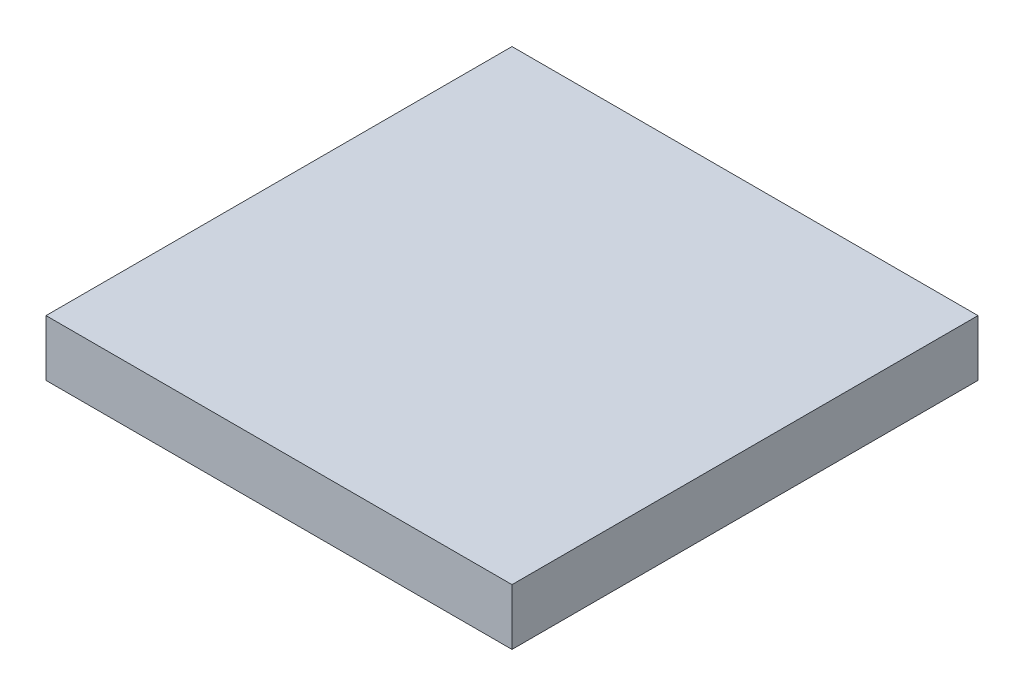
ISO-10303-21;
HEADER;
FILE_DESCRIPTION(('STEP AP214'),'2;1');
FILE_NAME('part.step','',(''),(''),'','','');
FILE_SCHEMA(('AUTOMOTIVE_DESIGN { 1 0 10303 214 1 1 1 1 }'));
ENDSEC;
DATA;
#1=APPLICATION_CONTEXT('core data for automotive mechanical design processes');
#2=APPLICATION_PROTOCOL_DEFINITION('international standard','automotive_design',2000,#1);
#3=PRODUCT_CONTEXT('',#1,'mechanical');
#4=PRODUCT('Part','Part','',(#3));
#5=PRODUCT_RELATED_PRODUCT_CATEGORY('part','',(#4));
#6=PRODUCT_DEFINITION_FORMATION('','',#4);
#7=PRODUCT_DEFINITION_CONTEXT('part definition',#1,'design');
#8=PRODUCT_DEFINITION('design','',#6,#7);
#9=PRODUCT_DEFINITION_SHAPE('','',#8);
#10=(LENGTH_UNIT() NAMED_UNIT(*) SI_UNIT(.MILLI.,.METRE.));
#11=(NAMED_UNIT(*) PLANE_ANGLE_UNIT() SI_UNIT($,.RADIAN.));
#12=(NAMED_UNIT(*) SI_UNIT($,.STERADIAN.) SOLID_ANGLE_UNIT());
#13=UNCERTAINTY_MEASURE_WITH_UNIT(LENGTH_MEASURE(1.E-05),#10,'distance_accuracy_value','');
#14=(GEOMETRIC_REPRESENTATION_CONTEXT(3) GLOBAL_UNCERTAINTY_ASSIGNED_CONTEXT((#13)) GLOBAL_UNIT_ASSIGNED_CONTEXT((#10,
#11,#12)) REPRESENTATION_CONTEXT('',''));
#15=CARTESIAN_POINT('',(0.,0.,0.));
#16=DIRECTION('',(0.,0.,1.));
#17=DIRECTION('',(1.,0.,0.));
#18=AXIS2_PLACEMENT_3D('',#15,#16,#17);
#19=CARTESIAN_POINT('',(4.15,1.,4.15));
#20=DIRECTION('',(-1.,0.,0.));
#21=DIRECTION('',(0.,0.,1.));
#22=AXIS2_PLACEMENT_3D('',#19,#20,#21);
#23=PLANE('',#22);
#24=DIRECTION('',(0.,0.,-1.));
#25=VECTOR('',#24,1.);
#26=CARTESIAN_POINT('',(4.15,0.,4.15));
#27=LINE('',#26,#25);
#28=CARTESIAN_POINT('',(4.15,0.,4.15));
#29=VERTEX_POINT('',#28);
#30=CARTESIAN_POINT('',(4.15,0.,-4.15));
#31=VERTEX_POINT('',#30);
#32=EDGE_CURVE('E104',#29,#31,#27,.T.);
#33=ORIENTED_EDGE('',*,*,#32,.T.);
#34=DIRECTION('',(0.,-1.,0.));
#35=VECTOR('',#34,1.);
#36=CARTESIAN_POINT('',(4.15,1.,-4.15));
#37=LINE('',#36,#35);
#38=CARTESIAN_POINT('',(4.15,1.,-4.15));
#39=VERTEX_POINT('',#38);
#40=EDGE_CURVE('E11',#39,#31,#37,.T.);
#41=ORIENTED_EDGE('',*,*,#40,.F.);
#42=DIRECTION('',(0.,0.,-1.));
#43=VECTOR('',#42,1.);
#44=CARTESIAN_POINT('',(4.15,1.,4.15));
#45=LINE('',#44,#43);
#46=CARTESIAN_POINT('',(4.15,1.,4.15));
#47=VERTEX_POINT('',#46);
#48=EDGE_CURVE('E92',#47,#39,#45,.T.);
#49=ORIENTED_EDGE('',*,*,#48,.F.);
#50=DIRECTION('',(0.,-1.,0.));
#51=VECTOR('',#50,1.);
#52=CARTESIAN_POINT('',(4.15,1.,4.15));
#53=LINE('',#52,#51);
#54=EDGE_CURVE('E100',#47,#29,#53,.T.);
#55=ORIENTED_EDGE('',*,*,#54,.T.);
#56=EDGE_LOOP('',(#33,#41,#49,#55));
#57=FACE_BOUND('',#56,.T.);
#58=ADVANCED_FACE('F41',(#57),#23,.F.);
#59=CARTESIAN_POINT('',(-4.15,1.,-4.15));
#60=DIRECTION('',(0.,0.,1.));
#61=DIRECTION('',(1.,0.,0.));
#62=AXIS2_PLACEMENT_3D('',#59,#60,#61);
#63=PLANE('',#62);
#64=DIRECTION('',(-1.,0.,0.));
#65=VECTOR('',#64,1.);
#66=CARTESIAN_POINT('',(-4.15,0.,-4.15));
#67=LINE('',#66,#65);
#68=CARTESIAN_POINT('',(-4.15,0.,-4.15));
#69=VERTEX_POINT('',#68);
#70=EDGE_CURVE('E96',#31,#69,#67,.T.);
#71=ORIENTED_EDGE('',*,*,#70,.T.);
#72=DIRECTION('',(0.,-1.,0.));
#73=VECTOR('',#72,1.);
#74=CARTESIAN_POINT('',(-4.15,1.,-4.15));
#75=LINE('',#74,#73);
#76=CARTESIAN_POINT('',(-4.15,1.,-4.15));
#77=VERTEX_POINT('',#76);
#78=EDGE_CURVE('E49',#77,#69,#75,.T.);
#79=ORIENTED_EDGE('',*,*,#78,.F.);
#80=DIRECTION('',(-1.,0.,0.));
#81=VECTOR('',#80,1.);
#82=CARTESIAN_POINT('',(-4.15,1.,-4.15));
#83=LINE('',#82,#81);
#84=EDGE_CURVE('E87',#39,#77,#83,.T.);
#85=ORIENTED_EDGE('',*,*,#84,.F.);
#86=ORIENTED_EDGE('',*,*,#40,.T.);
#87=EDGE_LOOP('',(#71,#79,#85,#86));
#88=FACE_BOUND('',#87,.T.);
#89=ADVANCED_FACE('F95',(#88),#63,.F.);
#90=CARTESIAN_POINT('',(-4.15,1.,4.15));
#91=DIRECTION('',(1.,0.,0.));
#92=DIRECTION('',(0.,0.,-1.));
#93=AXIS2_PLACEMENT_3D('',#90,#91,#92);
#94=PLANE('',#93);
#95=DIRECTION('',(0.,0.,1.));
#96=VECTOR('',#95,1.);
#97=CARTESIAN_POINT('',(-4.15,0.,4.15));
#98=LINE('',#97,#96);
#99=CARTESIAN_POINT('',(-4.15,0.,4.15));
#100=VERTEX_POINT('',#99);
#101=EDGE_CURVE('E74',#69,#100,#98,.T.);
#102=ORIENTED_EDGE('',*,*,#101,.T.);
#103=DIRECTION('',(0.,-1.,0.));
#104=VECTOR('',#103,1.);
#105=CARTESIAN_POINT('',(-4.15,1.,4.15));
#106=LINE('',#105,#104);
#107=CARTESIAN_POINT('',(-4.15,1.,4.15));
#108=VERTEX_POINT('',#107);
#109=EDGE_CURVE('E97',#108,#100,#106,.T.);
#110=ORIENTED_EDGE('',*,*,#109,.F.);
#111=DIRECTION('',(0.,0.,1.));
#112=VECTOR('',#111,1.);
#113=CARTESIAN_POINT('',(-4.15,1.,4.15));
#114=LINE('',#113,#112);
#115=EDGE_CURVE('E90',#77,#108,#114,.T.);
#116=ORIENTED_EDGE('',*,*,#115,.F.);
#117=ORIENTED_EDGE('',*,*,#78,.T.);
#118=EDGE_LOOP('',(#102,#110,#116,#117));
#119=FACE_BOUND('',#118,.T.);
#120=ADVANCED_FACE('F98',(#119),#94,.F.);
#121=CARTESIAN_POINT('',(-4.15,1.,4.15));
#122=DIRECTION('',(0.,0.,-1.));
#123=DIRECTION('',(-1.,0.,0.));
#124=AXIS2_PLACEMENT_3D('',#121,#122,#123);
#125=PLANE('',#124);
#126=DIRECTION('',(1.,0.,0.));
#127=VECTOR('',#126,1.);
#128=CARTESIAN_POINT('',(-4.15,0.,4.15));
#129=LINE('',#128,#127);
#130=EDGE_CURVE('E80',#100,#29,#129,.T.);
#131=ORIENTED_EDGE('',*,*,#130,.T.);
#132=ORIENTED_EDGE('',*,*,#54,.F.);
#133=DIRECTION('',(1.,0.,0.));
#134=VECTOR('',#133,1.);
#135=CARTESIAN_POINT('',(-4.15,1.,4.15));
#136=LINE('',#135,#134);
#137=EDGE_CURVE('E57',#108,#47,#136,.T.);
#138=ORIENTED_EDGE('',*,*,#137,.F.);
#139=ORIENTED_EDGE('',*,*,#109,.T.);
#140=EDGE_LOOP('',(#131,#132,#138,#139));
#141=FACE_BOUND('',#140,.T.);
#142=ADVANCED_FACE('F111',(#141),#125,.F.);
#143=CARTESIAN_POINT('',(0.,1.,0.));
#144=DIRECTION('',(0.,-1.,0.));
#145=DIRECTION('',(0.,0.,-1.));
#146=AXIS2_PLACEMENT_3D('',#143,#144,#145);
#147=PLANE('',#146);
#148=ORIENTED_EDGE('',*,*,#48,.T.);
#149=ORIENTED_EDGE('',*,*,#84,.T.);
#150=ORIENTED_EDGE('',*,*,#115,.T.);
#151=ORIENTED_EDGE('',*,*,#137,.T.);
#152=EDGE_LOOP('',(#148,#149,#150,#151));
#153=FACE_BOUND('',#152,.T.);
#154=ADVANCED_FACE('F88',(#153),#147,.F.);
#155=CARTESIAN_POINT('',(0.,0.,0.));
#156=DIRECTION('',(0.,-1.,0.));
#157=DIRECTION('',(0.,0.,-1.));
#158=AXIS2_PLACEMENT_3D('',#155,#156,#157);
#159=PLANE('',#158);
#160=ORIENTED_EDGE('',*,*,#32,.F.);
#161=ORIENTED_EDGE('',*,*,#130,.F.);
#162=ORIENTED_EDGE('',*,*,#101,.F.);
#163=ORIENTED_EDGE('',*,*,#70,.F.);
#164=EDGE_LOOP('',(#160,#161,#162,#163));
#165=FACE_BOUND('',#164,.T.);
#166=ADVANCED_FACE('F114',(#165),#159,.T.);
#167=CLOSED_SHELL('',(#58,#89,#120,#142,#154,#166));
#168=MANIFOLD_SOLID_BREP('B2',#167);
#169=ADVANCED_BREP_SHAPE_REPRESENTATION('',(#18,#168),#14);
#170=SHAPE_DEFINITION_REPRESENTATION(#9,#169);
ENDSEC;
END-ISO-10303-21;
